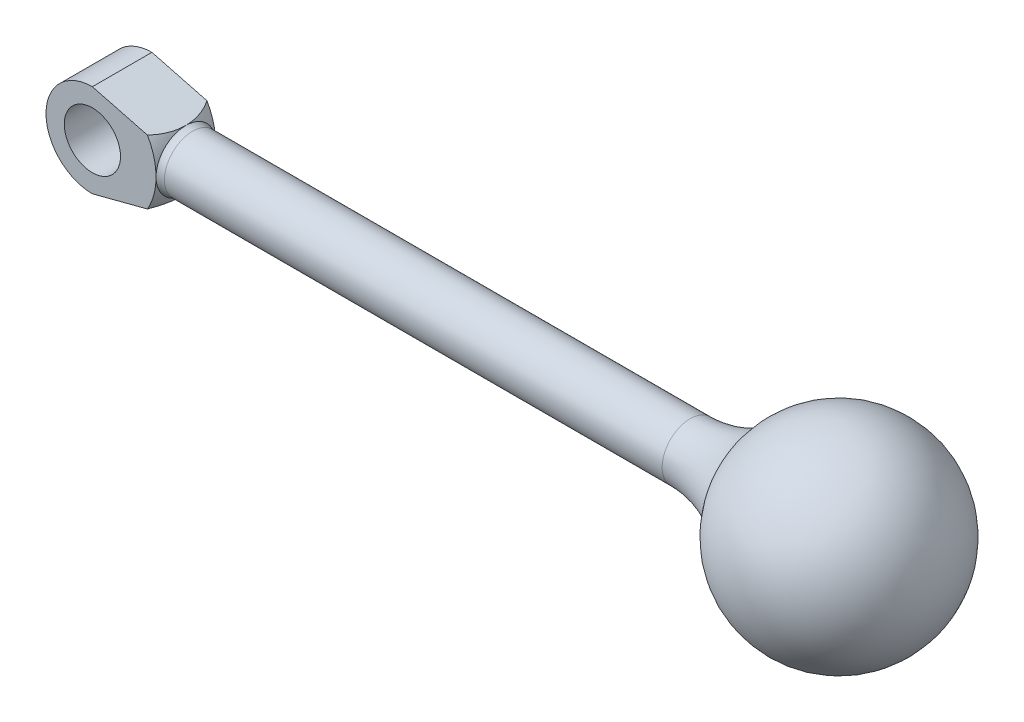
ISO-10303-21;
HEADER;
FILE_DESCRIPTION(('STEP AP214'),'2;1');
FILE_NAME('part.step','',(''),(''),'','','');
FILE_SCHEMA(('AUTOMOTIVE_DESIGN { 1 0 10303 214 1 1 1 1 }'));
ENDSEC;
DATA;
#1=APPLICATION_CONTEXT('core data for automotive mechanical design processes');
#2=APPLICATION_PROTOCOL_DEFINITION('international standard','automotive_design',2000,#1);
#3=PRODUCT_CONTEXT('',#1,'mechanical');
#4=PRODUCT('Part','Part','',(#3));
#5=PRODUCT_RELATED_PRODUCT_CATEGORY('part','',(#4));
#6=PRODUCT_DEFINITION_FORMATION('','',#4);
#7=PRODUCT_DEFINITION_CONTEXT('part definition',#1,'design');
#8=PRODUCT_DEFINITION('design','',#6,#7);
#9=PRODUCT_DEFINITION_SHAPE('','',#8);
#10=(LENGTH_UNIT() NAMED_UNIT(*) SI_UNIT(.MILLI.,.METRE.));
#11=(NAMED_UNIT(*) PLANE_ANGLE_UNIT() SI_UNIT($,.RADIAN.));
#12=(NAMED_UNIT(*) SI_UNIT($,.STERADIAN.) SOLID_ANGLE_UNIT());
#13=UNCERTAINTY_MEASURE_WITH_UNIT(LENGTH_MEASURE(1.E-05),#10,'distance_accuracy_value','');
#14=(GEOMETRIC_REPRESENTATION_CONTEXT(3) GLOBAL_UNCERTAINTY_ASSIGNED_CONTEXT((#13)) GLOBAL_UNIT_ASSIGNED_CONTEXT((#10,
#11,#12)) REPRESENTATION_CONTEXT('',''));
#15=CARTESIAN_POINT('',(0.,0.,0.));
#16=DIRECTION('',(0.,0.,1.));
#17=DIRECTION('',(1.,0.,0.));
#18=AXIS2_PLACEMENT_3D('',#15,#16,#17);
#19=CARTESIAN_POINT('',(-58.,0.,0.));
#20=DIRECTION('',(1.,0.,0.));
#21=DIRECTION('',(0.,0.,1.));
#22=AXIS2_PLACEMENT_3D('',#19,#20,#21);
#23=SPHERICAL_SURFACE('',#22,5.);
#24=CARTESIAN_POINT('',(-53.4705732250126,0.,0.));
#25=DIRECTION('',(1.,0.,0.));
#26=DIRECTION('',(0.,0.,-1.));
#27=AXIS2_PLACEMENT_3D('',#24,#25,#26);
#28=CIRCLE('',#27,2.11761495320256);
#29=CARTESIAN_POINT('',(-53.4705732250126,-2.11761495320256,1.1967857260764E-11));
#30=VERTEX_POINT('',#29);
#31=CARTESIAN_POINT('',(-53.4705732250126,0.,-2.11761495320256));
#32=VERTEX_POINT('',#31);
#33=EDGE_CURVE('E137',#30,#32,#28,.T.);
#34=ORIENTED_EDGE('',*,*,#33,.F.);
#35=CARTESIAN_POINT('',(-57.1939687660182,-3.08913906898367,0.));
#36=DIRECTION('',(-0.252471420774595,0.967604351836047,0.));
#37=DIRECTION('',(-0.967604351836048,-0.252471420774595,0.));
#38=AXIS2_PLACEMENT_3D('',#35,#36,#37);
#39=CIRCLE('',#38,3.84805580291196);
#40=CARTESIAN_POINT('',(-54.0850753519338,-2.27795344771059,-2.11761495320256));
#41=VERTEX_POINT('',#40);
#42=EDGE_CURVE('E123',#30,#41,#39,.T.);
#43=ORIENTED_EDGE('',*,*,#42,.T.);
#44=CARTESIAN_POINT('',(-58.,0.,-2.11761495320256));
#45=DIRECTION('',(0.,0.,1.));
#46=DIRECTION('',(1.,0.,0.));
#47=AXIS2_PLACEMENT_3D('',#44,#45,#46);
#48=CIRCLE('',#47,4.52942677498742);
#49=EDGE_CURVE('E148',#41,#32,#48,.T.);
#50=ORIENTED_EDGE('',*,*,#49,.T.);
#51=EDGE_LOOP('',(#34,#43,#50));
#52=FACE_BOUND('',#51,.T.);
#53=ADVANCED_FACE('F39',(#52),#23,.T.);
#54=CARTESIAN_POINT('',(-58.,0.,2.11761495320256));
#55=DIRECTION('',(0.,0.,1.));
#56=DIRECTION('',(1.,0.,0.));
#57=AXIS2_PLACEMENT_3D('',#54,#55,#56);
#58=CIRCLE('',#57,4.52942677498742);
#59=CARTESIAN_POINT('',(-54.0850753519338,-2.27795344771059,2.11761495320256));
#60=VERTEX_POINT('',#59);
#61=CARTESIAN_POINT('',(-53.4705732250126,0.,2.11761495320256));
#62=VERTEX_POINT('',#61);
#63=EDGE_CURVE('E133',#60,#62,#58,.T.);
#64=ORIENTED_EDGE('',*,*,#63,.F.);
#65=EDGE_CURVE('E126',#60,#30,#39,.T.);
#66=ORIENTED_EDGE('',*,*,#65,.T.);
#67=EDGE_CURVE('E138',#62,#30,#28,.T.);
#68=ORIENTED_EDGE('',*,*,#67,.F.);
#69=EDGE_LOOP('',(#64,#66,#68));
#70=FACE_BOUND('',#69,.T.);
#71=ADVANCED_FACE('F162',(#70),#23,.T.);
#72=CARTESIAN_POINT('',(-53.4705732250126,2.11761495320257,0.));
#73=VERTEX_POINT('',#72);
#74=EDGE_CURVE('E62',#73,#62,#28,.T.);
#75=ORIENTED_EDGE('',*,*,#74,.F.);
#76=CARTESIAN_POINT('',(-57.1939687660182,3.08913906898367,0.));
#77=DIRECTION('',(-0.252471420774593,-0.967604351836048,0.));
#78=DIRECTION('',(0.967604351836048,-0.252471420774593,0.));
#79=AXIS2_PLACEMENT_3D('',#76,#77,#78);
#80=CIRCLE('',#79,3.84805580291196);
#81=CARTESIAN_POINT('',(-54.0850753519338,2.2779534477106,2.11761495320256));
#82=VERTEX_POINT('',#81);
#83=EDGE_CURVE('E122',#73,#82,#80,.T.);
#84=ORIENTED_EDGE('',*,*,#83,.T.);
#85=EDGE_CURVE('E116',#62,#82,#58,.T.);
#86=ORIENTED_EDGE('',*,*,#85,.F.);
#87=EDGE_LOOP('',(#75,#84,#86));
#88=FACE_BOUND('',#87,.T.);
#89=ADVANCED_FACE('F171',(#88),#23,.T.);
#90=CARTESIAN_POINT('',(-54.0850753519338,2.2779534477106,-2.11761495320256));
#91=VERTEX_POINT('',#90);
#92=EDGE_CURVE('E149',#32,#91,#48,.T.);
#93=ORIENTED_EDGE('',*,*,#92,.T.);
#94=EDGE_CURVE('E54',#91,#73,#80,.T.);
#95=ORIENTED_EDGE('',*,*,#94,.T.);
#96=EDGE_CURVE('E134',#32,#73,#28,.T.);
#97=ORIENTED_EDGE('',*,*,#96,.F.);
#98=EDGE_LOOP('',(#93,#95,#97));
#99=FACE_BOUND('',#98,.T.);
#100=ADVANCED_FACE('F169',(#99),#23,.T.);
#101=CARTESIAN_POINT('',(-7.,0.,0.));
#102=DIRECTION('',(1.,0.,0.));
#103=DIRECTION('',(0.,0.,1.));
#104=AXIS2_PLACEMENT_3D('',#101,#102,#103);
#105=SPHERICAL_SURFACE('',#104,7.);
#106=CARTESIAN_POINT('',(-13.1322529271779,0.,0.));
#107=DIRECTION('',(-1.,0.,0.));
#108=DIRECTION('',(0.,0.,1.));
#109=AXIS2_PLACEMENT_3D('',#106,#107,#108);
#110=CIRCLE('',#109,3.37571829943168);
#111=CARTESIAN_POINT('',(-13.1322529271779,0.,3.37571829943168));
#112=VERTEX_POINT('',#111);
#113=EDGE_CURVE('E144',#112,#112,#110,.T.);
#114=ORIENTED_EDGE('',*,*,#113,.F.);
#115=EDGE_LOOP('',(#114));
#116=FACE_BOUND('',#115,.T.);
#117=ADVANCED_FACE('F41',(#116),#105,.T.);
#118=CARTESIAN_POINT('',(-17.5843522160633,0.,0.));
#119=DIRECTION('',(1.,0.,0.));
#120=DIRECTION('',(0.,0.,-1.));
#121=AXIS2_PLACEMENT_3D('',#118,#119,#120);
#122=TOROIDAL_SURFACE('',#121,9.89180056936627,7.89180056936627);
#123=ORIENTED_EDGE('',*,*,#113,.T.);
#124=EDGE_LOOP('',(#123));
#125=FACE_BOUND('',#124,.T.);
#126=CARTESIAN_POINT('',(-17.5843522160633,0.,0.));
#127=DIRECTION('',(1.,0.,0.));
#128=DIRECTION('',(0.,0.,-1.));
#129=AXIS2_PLACEMENT_3D('',#126,#127,#128);
#130=CIRCLE('',#129,2.);
#131=CARTESIAN_POINT('',(-17.5843522160633,0.,-2.));
#132=VERTEX_POINT('',#131);
#133=EDGE_CURVE('E141',#132,#132,#130,.T.);
#134=ORIENTED_EDGE('',*,*,#133,.T.);
#135=EDGE_LOOP('',(#134));
#136=FACE_BOUND('',#135,.T.);
#137=ADVANCED_FACE('F276',(#125,#136),#122,.F.);
#138=CARTESIAN_POINT('',(0.,0.,0.));
#139=DIRECTION('',(1.,0.,0.));
#140=DIRECTION('',(0.,0.,-1.));
#141=AXIS2_PLACEMENT_3D('',#138,#139,#140);
#142=CYLINDRICAL_SURFACE('',#141,2.);
#143=ORIENTED_EDGE('',*,*,#133,.F.);
#144=EDGE_LOOP('',(#143));
#145=FACE_BOUND('',#144,.T.);
#146=CARTESIAN_POINT('',(-52.9930573764232,0.,0.));
#147=DIRECTION('',(1.,0.,0.));
#148=DIRECTION('',(0.,0.,-1.));
#149=AXIS2_PLACEMENT_3D('',#146,#147,#148);
#150=CIRCLE('',#149,2.);
#151=CARTESIAN_POINT('',(-52.9930573764232,0.,-2.));
#152=VERTEX_POINT('',#151);
#153=EDGE_CURVE('E136',#152,#152,#150,.T.);
#154=ORIENTED_EDGE('',*,*,#153,.T.);
#155=EDGE_LOOP('',(#154));
#156=FACE_BOUND('',#155,.T.);
#157=ADVANCED_FACE('F242',(#145,#156),#142,.T.);
#158=CARTESIAN_POINT('',(-53.,0.,0.));
#159=DIRECTION('',(1.,0.,0.));
#160=DIRECTION('',(0.,0.,-1.));
#161=AXIS2_PLACEMENT_3D('',#158,#159,#160);
#162=TOROIDAL_SURFACE('',#161,2.99997589969853,0.999999999999999);
#163=ORIENTED_EDGE('',*,*,#153,.F.);
#164=EDGE_LOOP('',(#163));
#165=FACE_BOUND('',#164,.T.);
#166=ORIENTED_EDGE('',*,*,#96,.T.);
#167=ORIENTED_EDGE('',*,*,#74,.T.);
#168=ORIENTED_EDGE('',*,*,#67,.T.);
#169=ORIENTED_EDGE('',*,*,#33,.T.);
#170=EDGE_LOOP('',(#166,#167,#168,#169));
#171=FACE_BOUND('',#170,.T.);
#172=ADVANCED_FACE('F165',(#165,#171),#162,.F.);
#173=CARTESIAN_POINT('',(0.,10.,2.11761495320256));
#174=DIRECTION('',(0.,0.,1.));
#175=DIRECTION('',(1.,0.,0.));
#176=AXIS2_PLACEMENT_3D('',#173,#174,#175);
#177=PLANE('',#176);
#178=DIRECTION('',(-0.967604351836048,-0.252471420774595,0.));
#179=VECTOR('',#178,1.);
#180=CARTESIAN_POINT('',(-58.,-3.29945214833883,2.11761495320256));
#181=LINE('',#180,#179);
#182=CARTESIAN_POINT('',(-58.,-3.29945214833883,2.11761495320256));
#183=VERTEX_POINT('',#182);
#184=EDGE_CURVE('E102',#60,#183,#181,.T.);
#185=ORIENTED_EDGE('',*,*,#184,.F.);
#186=ORIENTED_EDGE('',*,*,#63,.T.);
#187=ORIENTED_EDGE('',*,*,#85,.T.);
#188=DIRECTION('',(0.967604351836048,-0.252471420774593,0.));
#189=VECTOR('',#188,1.);
#190=CARTESIAN_POINT('',(-58.,3.29945214833883,2.11761495320256));
#191=LINE('',#190,#189);
#192=CARTESIAN_POINT('',(-58.,3.29945214833883,2.11761495320256));
#193=VERTEX_POINT('',#192);
#194=EDGE_CURVE('E96',#193,#82,#191,.T.);
#195=ORIENTED_EDGE('',*,*,#194,.F.);
#196=CARTESIAN_POINT('',(-58.,0.,2.11761495320256));
#197=DIRECTION('',(0.,0.,-1.));
#198=DIRECTION('',(1.,0.,0.));
#199=AXIS2_PLACEMENT_3D('',#196,#197,#198);
#200=CIRCLE('',#199,3.29945214833883);
#201=EDGE_CURVE('E105',#183,#193,#200,.T.);
#202=ORIENTED_EDGE('',*,*,#201,.F.);
#203=EDGE_LOOP('',(#185,#186,#187,#195,#202));
#204=FACE_BOUND('',#203,.T.);
#205=CARTESIAN_POINT('',(-58.,0.,2.11761495320256));
#206=DIRECTION('',(0.,0.,1.));
#207=DIRECTION('',(1.,0.,0.));
#208=AXIS2_PLACEMENT_3D('',#205,#206,#207);
#209=CIRCLE('',#208,2.);
#210=CARTESIAN_POINT('',(-56.,0.,2.11761495320256));
#211=VERTEX_POINT('',#210);
#212=EDGE_CURVE('E130',#211,#211,#209,.T.);
#213=ORIENTED_EDGE('',*,*,#212,.F.);
#214=EDGE_LOOP('',(#213));
#215=FACE_BOUND('',#214,.T.);
#216=ADVANCED_FACE('F113',(#204,#215),#177,.T.);
#217=CARTESIAN_POINT('',(0.,10.,-2.11761495320256));
#218=DIRECTION('',(0.,0.,1.));
#219=DIRECTION('',(1.,0.,0.));
#220=AXIS2_PLACEMENT_3D('',#217,#218,#219);
#221=PLANE('',#220);
#222=CARTESIAN_POINT('',(-58.,0.,-2.11761495320256));
#223=DIRECTION('',(0.,0.,-1.));
#224=DIRECTION('',(-1.,0.,0.));
#225=AXIS2_PLACEMENT_3D('',#222,#223,#224);
#226=CIRCLE('',#225,2.);
#227=CARTESIAN_POINT('',(-60.,0.,-2.11761495320256));
#228=VERTEX_POINT('',#227);
#229=EDGE_CURVE('E127',#228,#228,#226,.T.);
#230=ORIENTED_EDGE('',*,*,#229,.F.);
#231=EDGE_LOOP('',(#230));
#232=FACE_BOUND('',#231,.T.);
#233=ORIENTED_EDGE('',*,*,#49,.F.);
#234=DIRECTION('',(-0.967604351836048,-0.252471420774595,0.));
#235=VECTOR('',#234,1.);
#236=CARTESIAN_POINT('',(-0.448069773321538,11.717240950528,-2.11761495320256));
#237=LINE('',#236,#235);
#238=CARTESIAN_POINT('',(-58.,-3.29945214833883,-2.11761495320256));
#239=VERTEX_POINT('',#238);
#240=EDGE_CURVE('E11',#41,#239,#237,.T.);
#241=ORIENTED_EDGE('',*,*,#240,.T.);
#242=CARTESIAN_POINT('',(-58.,0.,-2.11761495320256));
#243=DIRECTION('',(0.,0.,1.));
#244=DIRECTION('',(1.,0.,0.));
#245=AXIS2_PLACEMENT_3D('',#242,#243,#244);
#246=CIRCLE('',#245,3.29945214833883);
#247=CARTESIAN_POINT('',(-58.,3.29945214833883,-2.11761495320256));
#248=VERTEX_POINT('',#247);
#249=EDGE_CURVE('E47',#239,#248,#246,.F.);
#250=ORIENTED_EDGE('',*,*,#249,.T.);
#251=DIRECTION('',(0.967604351836048,-0.252471420774593,0.));
#252=VECTOR('',#251,1.);
#253=CARTESIAN_POINT('',(-5.33391868243603,-10.442404584369,-2.11761495320256));
#254=LINE('',#253,#252);
#255=EDGE_CURVE('E98',#248,#91,#254,.T.);
#256=ORIENTED_EDGE('',*,*,#255,.T.);
#257=ORIENTED_EDGE('',*,*,#92,.F.);
#258=EDGE_LOOP('',(#233,#241,#250,#256,#257));
#259=FACE_BOUND('',#258,.T.);
#260=ADVANCED_FACE('F154',(#232,#259),#221,.F.);
#261=CARTESIAN_POINT('',(-58.,0.,7.88238504679744));
#262=DIRECTION('',(0.,0.,-1.));
#263=DIRECTION('',(-1.,0.,0.));
#264=AXIS2_PLACEMENT_3D('',#261,#262,#263);
#265=CYLINDRICAL_SURFACE('',#264,2.);
#266=ORIENTED_EDGE('',*,*,#212,.T.);
#267=EDGE_LOOP('',(#266));
#268=FACE_BOUND('',#267,.T.);
#269=ORIENTED_EDGE('',*,*,#229,.T.);
#270=EDGE_LOOP('',(#269));
#271=FACE_BOUND('',#270,.T.);
#272=ADVANCED_FACE('F189',(#268,#271),#265,.F.);
#273=CARTESIAN_POINT('',(-58.,0.,-9.88238504679745));
#274=DIRECTION('',(0.,0.,1.));
#275=DIRECTION('',(1.,0.,0.));
#276=AXIS2_PLACEMENT_3D('',#273,#274,#275);
#277=CYLINDRICAL_SURFACE('',#276,3.29945214833883);
#278=DIRECTION('',(0.,0.,1.));
#279=VECTOR('',#278,1.);
#280=CARTESIAN_POINT('',(-58.,-3.29945214833883,-9.88238504679745));
#281=LINE('',#280,#279);
#282=EDGE_CURVE('E101',#239,#183,#281,.T.);
#283=ORIENTED_EDGE('',*,*,#282,.T.);
#284=ORIENTED_EDGE('',*,*,#201,.T.);
#285=DIRECTION('',(0.,0.,1.));
#286=VECTOR('',#285,1.);
#287=CARTESIAN_POINT('',(-58.,3.29945214833883,-9.88238504679745));
#288=LINE('',#287,#286);
#289=EDGE_CURVE('E92',#248,#193,#288,.T.);
#290=ORIENTED_EDGE('',*,*,#289,.F.);
#291=ORIENTED_EDGE('',*,*,#249,.F.);
#292=EDGE_LOOP('',(#283,#284,#290,#291));
#293=FACE_BOUND('',#292,.T.);
#294=ADVANCED_FACE('F106',(#293),#277,.T.);
#295=CARTESIAN_POINT('',(-58.,-3.29945214833883,-9.88238504679745));
#296=DIRECTION('',(-0.252471420774595,0.967604351836047,0.));
#297=DIRECTION('',(-0.967604351836048,-0.252471420774595,0.));
#298=AXIS2_PLACEMENT_3D('',#295,#296,#297);
#299=PLANE('',#298);
#300=ORIENTED_EDGE('',*,*,#184,.T.);
#301=ORIENTED_EDGE('',*,*,#282,.F.);
#302=ORIENTED_EDGE('',*,*,#240,.F.);
#303=ORIENTED_EDGE('',*,*,#42,.F.);
#304=ORIENTED_EDGE('',*,*,#65,.F.);
#305=EDGE_LOOP('',(#300,#301,#302,#303,#304));
#306=FACE_BOUND('',#305,.T.);
#307=ADVANCED_FACE('F157',(#306),#299,.F.);
#308=CARTESIAN_POINT('',(-58.,3.29945214833883,-9.88238504679745));
#309=DIRECTION('',(-0.252471420774593,-0.967604351836048,0.));
#310=DIRECTION('',(0.967604351836048,-0.252471420774593,0.));
#311=AXIS2_PLACEMENT_3D('',#308,#309,#310);
#312=PLANE('',#311);
#313=ORIENTED_EDGE('',*,*,#94,.F.);
#314=ORIENTED_EDGE('',*,*,#255,.F.);
#315=ORIENTED_EDGE('',*,*,#289,.T.);
#316=ORIENTED_EDGE('',*,*,#194,.T.);
#317=ORIENTED_EDGE('',*,*,#83,.F.);
#318=EDGE_LOOP('',(#313,#314,#315,#316,#317));
#319=FACE_BOUND('',#318,.T.);
#320=ADVANCED_FACE('F94',(#319),#312,.F.);
#321=CLOSED_SHELL('',(#53,#71,#89,#100,#117,#137,#157,#172,#216,#260,#272,#294,#307,#320));
#322=MANIFOLD_SOLID_BREP('B2',#321);
#323=ADVANCED_BREP_SHAPE_REPRESENTATION('',(#18,#322),#14);
#324=SHAPE_DEFINITION_REPRESENTATION(#9,#323);
ENDSEC;
END-ISO-10303-21;
